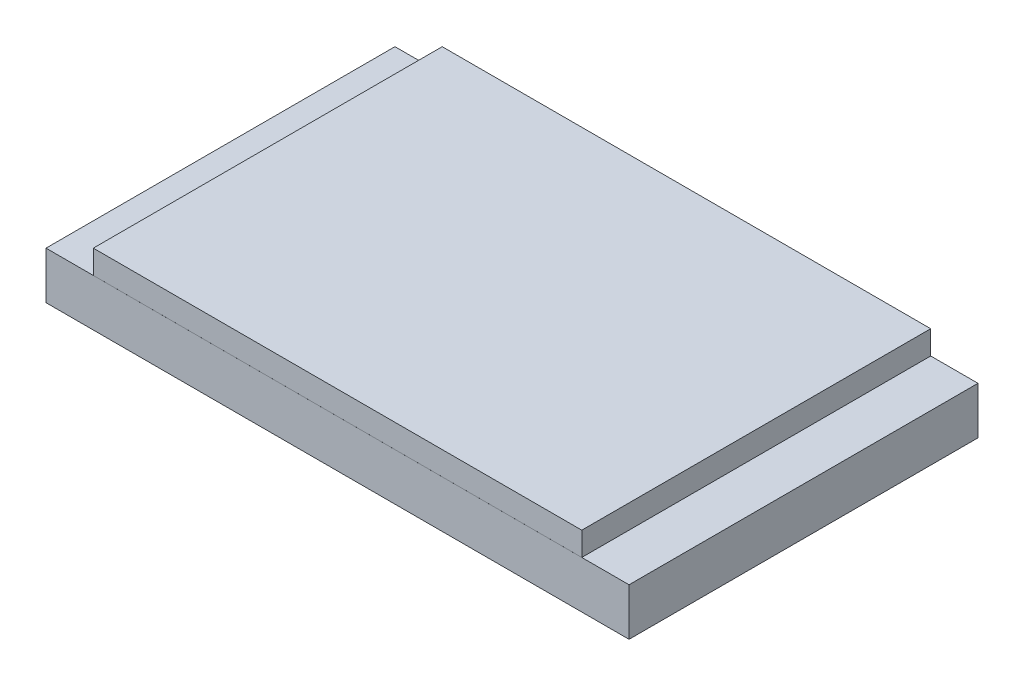
ISO-10303-21;
HEADER;
FILE_DESCRIPTION(('STEP AP214'),'2;1');
FILE_NAME('part.step','',(''),(''),'','','');
FILE_SCHEMA(('AUTOMOTIVE_DESIGN { 1 0 10303 214 1 1 1 1 }'));
ENDSEC;
DATA;
#1=APPLICATION_CONTEXT('core data for automotive mechanical design processes');
#2=APPLICATION_PROTOCOL_DEFINITION('international standard','automotive_design',2000,#1);
#3=PRODUCT_CONTEXT('',#1,'mechanical');
#4=PRODUCT('Part','Part','',(#3));
#5=PRODUCT_RELATED_PRODUCT_CATEGORY('part','',(#4));
#6=PRODUCT_DEFINITION_FORMATION('','',#4);
#7=PRODUCT_DEFINITION_CONTEXT('part definition',#1,'design');
#8=PRODUCT_DEFINITION('design','',#6,#7);
#9=PRODUCT_DEFINITION_SHAPE('','',#8);
#10=(LENGTH_UNIT() NAMED_UNIT(*) SI_UNIT(.MILLI.,.METRE.));
#11=(NAMED_UNIT(*) PLANE_ANGLE_UNIT() SI_UNIT($,.RADIAN.));
#12=(NAMED_UNIT(*) SI_UNIT($,.STERADIAN.) SOLID_ANGLE_UNIT());
#13=UNCERTAINTY_MEASURE_WITH_UNIT(LENGTH_MEASURE(1.E-05),#10,'distance_accuracy_value','');
#14=(GEOMETRIC_REPRESENTATION_CONTEXT(3) GLOBAL_UNCERTAINTY_ASSIGNED_CONTEXT((#13)) GLOBAL_UNIT_ASSIGNED_CONTEXT((#10,
#11,#12)) REPRESENTATION_CONTEXT('',''));
#15=CARTESIAN_POINT('',(0.,0.,0.));
#16=DIRECTION('',(0.,0.,1.));
#17=DIRECTION('',(1.,0.,0.));
#18=AXIS2_PLACEMENT_3D('',#15,#16,#17);
#19=CARTESIAN_POINT('',(-20.6688301686511,4.,14.7634501204651));
#20=DIRECTION('',(1.,0.,0.));
#21=DIRECTION('',(0.,0.,-1.));
#22=AXIS2_PLACEMENT_3D('',#19,#20,#21);
#23=PLANE('',#22);
#24=DIRECTION('',(0.,0.,1.));
#25=VECTOR('',#24,1.);
#26=CARTESIAN_POINT('',(-20.6688301686511,2.,14.7634501204651));
#27=LINE('',#26,#25);
#28=CARTESIAN_POINT('',(-20.6688301686511,2.,-14.763450120465));
#29=VERTEX_POINT('',#28);
#30=CARTESIAN_POINT('',(-20.6688301686511,2.,14.7634501204651));
#31=VERTEX_POINT('',#30);
#32=EDGE_CURVE('E133',#29,#31,#27,.T.);
#33=ORIENTED_EDGE('',*,*,#32,.T.);
#34=DIRECTION('',(0.,-1.,0.));
#35=VECTOR('',#34,1.);
#36=CARTESIAN_POINT('',(-20.6688301686511,4.,14.7634501204651));
#37=LINE('',#36,#35);
#38=CARTESIAN_POINT('',(-20.6688301686511,4.,14.7634501204651));
#39=VERTEX_POINT('',#38);
#40=EDGE_CURVE('E11',#39,#31,#37,.T.);
#41=ORIENTED_EDGE('',*,*,#40,.F.);
#42=DIRECTION('',(0.,0.,1.));
#43=VECTOR('',#42,1.);
#44=CARTESIAN_POINT('',(-20.6688301686511,4.,14.7634501204651));
#45=LINE('',#44,#43);
#46=CARTESIAN_POINT('',(-20.6688301686511,4.,-14.763450120465));
#47=VERTEX_POINT('',#46);
#48=EDGE_CURVE('E144',#47,#39,#45,.T.);
#49=ORIENTED_EDGE('',*,*,#48,.F.);
#50=DIRECTION('',(0.,-1.,0.));
#51=VECTOR('',#50,1.);
#52=CARTESIAN_POINT('',(-20.6688301686511,4.,-14.763450120465));
#53=LINE('',#52,#51);
#54=EDGE_CURVE('E155',#47,#29,#53,.T.);
#55=ORIENTED_EDGE('',*,*,#54,.T.);
#56=EDGE_LOOP('',(#33,#41,#49,#55));
#57=FACE_BOUND('',#56,.T.);
#58=ADVANCED_FACE('F43',(#57),#23,.F.);
#59=CARTESIAN_POINT('',(20.6688301686511,4.,14.7634501204651));
#60=DIRECTION('',(0.,0.,-1.));
#61=DIRECTION('',(-1.,0.,0.));
#62=AXIS2_PLACEMENT_3D('',#59,#60,#61);
#63=PLANE('',#62);
#64=DIRECTION('',(1.,0.,0.));
#65=VECTOR('',#64,1.);
#66=CARTESIAN_POINT('',(20.6688301686511,2.,14.7634501204651));
#67=LINE('',#66,#65);
#68=CARTESIAN_POINT('',(20.6688301686511,2.,14.7634501204651));
#69=VERTEX_POINT('',#68);
#70=EDGE_CURVE('E138',#31,#69,#67,.T.);
#71=ORIENTED_EDGE('',*,*,#70,.T.);
#72=DIRECTION('',(0.,-1.,0.));
#73=VECTOR('',#72,1.);
#74=CARTESIAN_POINT('',(20.6688301686511,4.,14.7634501204651));
#75=LINE('',#74,#73);
#76=CARTESIAN_POINT('',(20.6688301686511,4.,14.7634501204651));
#77=VERTEX_POINT('',#76);
#78=EDGE_CURVE('E52',#77,#69,#75,.T.);
#79=ORIENTED_EDGE('',*,*,#78,.F.);
#80=DIRECTION('',(1.,0.,0.));
#81=VECTOR('',#80,1.);
#82=CARTESIAN_POINT('',(20.6688301686511,4.,14.7634501204651));
#83=LINE('',#82,#81);
#84=EDGE_CURVE('E147',#39,#77,#83,.T.);
#85=ORIENTED_EDGE('',*,*,#84,.F.);
#86=ORIENTED_EDGE('',*,*,#40,.T.);
#87=EDGE_LOOP('',(#71,#79,#85,#86));
#88=FACE_BOUND('',#87,.T.);
#89=ADVANCED_FACE('F182',(#88),#63,.F.);
#90=CARTESIAN_POINT('',(20.6688301686511,4.,14.7634501204651));
#91=DIRECTION('',(-1.,0.,0.));
#92=DIRECTION('',(0.,0.,1.));
#93=AXIS2_PLACEMENT_3D('',#90,#91,#92);
#94=PLANE('',#93);
#95=DIRECTION('',(0.,0.,-1.));
#96=VECTOR('',#95,1.);
#97=CARTESIAN_POINT('',(20.6688301686511,2.,14.7634501204651));
#98=LINE('',#97,#96);
#99=CARTESIAN_POINT('',(20.6688301686511,2.,-14.763450120465));
#100=VERTEX_POINT('',#99);
#101=EDGE_CURVE('E160',#69,#100,#98,.T.);
#102=ORIENTED_EDGE('',*,*,#101,.T.);
#103=DIRECTION('',(0.,-1.,0.));
#104=VECTOR('',#103,1.);
#105=CARTESIAN_POINT('',(20.6688301686511,4.,-14.763450120465));
#106=LINE('',#105,#104);
#107=CARTESIAN_POINT('',(20.6688301686511,4.,-14.763450120465));
#108=VERTEX_POINT('',#107);
#109=EDGE_CURVE('E170',#108,#100,#106,.T.);
#110=ORIENTED_EDGE('',*,*,#109,.F.);
#111=DIRECTION('',(0.,0.,-1.));
#112=VECTOR('',#111,1.);
#113=CARTESIAN_POINT('',(20.6688301686511,4.,14.7634501204651));
#114=LINE('',#113,#112);
#115=EDGE_CURVE('E151',#77,#108,#114,.T.);
#116=ORIENTED_EDGE('',*,*,#115,.F.);
#117=ORIENTED_EDGE('',*,*,#78,.T.);
#118=EDGE_LOOP('',(#102,#110,#116,#117));
#119=FACE_BOUND('',#118,.T.);
#120=ADVANCED_FACE('F178',(#119),#94,.F.);
#121=CARTESIAN_POINT('',(20.6688301686511,4.,-14.763450120465));
#122=DIRECTION('',(0.,0.,1.));
#123=DIRECTION('',(1.,0.,0.));
#124=AXIS2_PLACEMENT_3D('',#121,#122,#123);
#125=PLANE('',#124);
#126=DIRECTION('',(-1.,0.,0.));
#127=VECTOR('',#126,1.);
#128=CARTESIAN_POINT('',(20.6688301686511,2.,-14.763450120465));
#129=LINE('',#128,#127);
#130=EDGE_CURVE('E148',#100,#29,#129,.T.);
#131=ORIENTED_EDGE('',*,*,#130,.T.);
#132=ORIENTED_EDGE('',*,*,#54,.F.);
#133=DIRECTION('',(-1.,0.,0.));
#134=VECTOR('',#133,1.);
#135=CARTESIAN_POINT('',(20.6688301686511,4.,-14.763450120465));
#136=LINE('',#135,#134);
#137=EDGE_CURVE('E59',#108,#47,#136,.T.);
#138=ORIENTED_EDGE('',*,*,#137,.F.);
#139=ORIENTED_EDGE('',*,*,#109,.T.);
#140=EDGE_LOOP('',(#131,#132,#138,#139));
#141=FACE_BOUND('',#140,.T.);
#142=ADVANCED_FACE('F185',(#141),#125,.F.);
#143=CARTESIAN_POINT('',(0.,4.,0.));
#144=DIRECTION('',(0.,1.,0.));
#145=DIRECTION('',(0.,0.,1.));
#146=AXIS2_PLACEMENT_3D('',#143,#144,#145);
#147=PLANE('',#146);
#148=ORIENTED_EDGE('',*,*,#48,.T.);
#149=ORIENTED_EDGE('',*,*,#84,.T.);
#150=ORIENTED_EDGE('',*,*,#115,.T.);
#151=ORIENTED_EDGE('',*,*,#137,.T.);
#152=EDGE_LOOP('',(#148,#149,#150,#151));
#153=FACE_BOUND('',#152,.T.);
#154=ADVANCED_FACE('F188',(#153),#147,.T.);
#155=CARTESIAN_POINT('',(0.,2.,0.));
#156=DIRECTION('',(0.,1.,0.));
#157=DIRECTION('',(0.,0.,1.));
#158=AXIS2_PLACEMENT_3D('',#155,#156,#157);
#159=PLANE('',#158);
#160=DIRECTION('',(0.,0.,1.));
#161=VECTOR('',#160,1.);
#162=CARTESIAN_POINT('',(-24.67,2.,14.765));
#163=LINE('',#162,#161);
#164=CARTESIAN_POINT('',(-24.67,2.,-14.765));
#165=VERTEX_POINT('',#164);
#166=CARTESIAN_POINT('',(-24.67,2.,14.765));
#167=VERTEX_POINT('',#166);
#168=EDGE_CURVE('E116',#165,#167,#163,.T.);
#169=ORIENTED_EDGE('',*,*,#168,.T.);
#170=DIRECTION('',(1.,0.,0.));
#171=VECTOR('',#170,1.);
#172=CARTESIAN_POINT('',(24.67,2.,14.765));
#173=LINE('',#172,#171);
#174=CARTESIAN_POINT('',(24.67,2.,14.765));
#175=VERTEX_POINT('',#174);
#176=EDGE_CURVE('E104',#167,#175,#173,.T.);
#177=ORIENTED_EDGE('',*,*,#176,.T.);
#178=DIRECTION('',(0.,0.,-1.));
#179=VECTOR('',#178,1.);
#180=CARTESIAN_POINT('',(24.67,2.,14.765));
#181=LINE('',#180,#179);
#182=CARTESIAN_POINT('',(24.67,2.,-14.765));
#183=VERTEX_POINT('',#182);
#184=EDGE_CURVE('E115',#175,#183,#181,.T.);
#185=ORIENTED_EDGE('',*,*,#184,.T.);
#186=DIRECTION('',(-1.,0.,0.));
#187=VECTOR('',#186,1.);
#188=CARTESIAN_POINT('',(24.67,2.,-14.765));
#189=LINE('',#188,#187);
#190=EDGE_CURVE('E122',#183,#165,#189,.T.);
#191=ORIENTED_EDGE('',*,*,#190,.T.);
#192=EDGE_LOOP('',(#169,#177,#185,#191));
#193=FACE_BOUND('',#192,.T.);
#194=ORIENTED_EDGE('',*,*,#32,.F.);
#195=ORIENTED_EDGE('',*,*,#130,.F.);
#196=ORIENTED_EDGE('',*,*,#101,.F.);
#197=ORIENTED_EDGE('',*,*,#70,.F.);
#198=EDGE_LOOP('',(#194,#195,#196,#197));
#199=FACE_BOUND('',#198,.T.);
#200=ADVANCED_FACE('F119',(#193,#199),#159,.T.);
#201=CARTESIAN_POINT('',(-24.67,2.,14.765));
#202=DIRECTION('',(1.,0.,0.));
#203=DIRECTION('',(0.,0.,-1.));
#204=AXIS2_PLACEMENT_3D('',#201,#202,#203);
#205=PLANE('',#204);
#206=DIRECTION('',(0.,0.,1.));
#207=VECTOR('',#206,1.);
#208=CARTESIAN_POINT('',(-24.67,-2.,14.765));
#209=LINE('',#208,#207);
#210=CARTESIAN_POINT('',(-24.67,-2.,-14.765));
#211=VERTEX_POINT('',#210);
#212=CARTESIAN_POINT('',(-24.67,-2.,14.765));
#213=VERTEX_POINT('',#212);
#214=EDGE_CURVE('E131',#211,#213,#209,.T.);
#215=ORIENTED_EDGE('',*,*,#214,.T.);
#216=DIRECTION('',(0.,-1.,0.));
#217=VECTOR('',#216,1.);
#218=CARTESIAN_POINT('',(-24.67,2.,14.765));
#219=LINE('',#218,#217);
#220=EDGE_CURVE('E108',#167,#213,#219,.T.);
#221=ORIENTED_EDGE('',*,*,#220,.F.);
#222=ORIENTED_EDGE('',*,*,#168,.F.);
#223=DIRECTION('',(0.,-1.,0.));
#224=VECTOR('',#223,1.);
#225=CARTESIAN_POINT('',(-24.67,2.,-14.765));
#226=LINE('',#225,#224);
#227=EDGE_CURVE('E318',#165,#211,#226,.T.);
#228=ORIENTED_EDGE('',*,*,#227,.T.);
#229=EDGE_LOOP('',(#215,#221,#222,#228));
#230=FACE_BOUND('',#229,.T.);
#231=ADVANCED_FACE('F129',(#230),#205,.F.);
#232=CARTESIAN_POINT('',(24.67,2.,14.765));
#233=DIRECTION('',(0.,0.,-1.));
#234=DIRECTION('',(-1.,0.,0.));
#235=AXIS2_PLACEMENT_3D('',#232,#233,#234);
#236=PLANE('',#235);
#237=DIRECTION('',(1.,0.,0.));
#238=VECTOR('',#237,1.);
#239=CARTESIAN_POINT('',(24.67,-2.,14.765));
#240=LINE('',#239,#238);
#241=CARTESIAN_POINT('',(24.67,-2.,14.765));
#242=VERTEX_POINT('',#241);
#243=EDGE_CURVE('E305',#213,#242,#240,.T.);
#244=ORIENTED_EDGE('',*,*,#243,.T.);
#245=DIRECTION('',(0.,-1.,0.));
#246=VECTOR('',#245,1.);
#247=CARTESIAN_POINT('',(24.67,2.,14.765));
#248=LINE('',#247,#246);
#249=EDGE_CURVE('E111',#175,#242,#248,.T.);
#250=ORIENTED_EDGE('',*,*,#249,.F.);
#251=ORIENTED_EDGE('',*,*,#176,.F.);
#252=ORIENTED_EDGE('',*,*,#220,.T.);
#253=EDGE_LOOP('',(#244,#250,#251,#252));
#254=FACE_BOUND('',#253,.T.);
#255=ADVANCED_FACE('F106',(#254),#236,.F.);
#256=CARTESIAN_POINT('',(24.67,2.,14.765));
#257=DIRECTION('',(-1.,0.,0.));
#258=DIRECTION('',(0.,0.,1.));
#259=AXIS2_PLACEMENT_3D('',#256,#257,#258);
#260=PLANE('',#259);
#261=DIRECTION('',(0.,0.,-1.));
#262=VECTOR('',#261,1.);
#263=CARTESIAN_POINT('',(24.67,-2.,14.765));
#264=LINE('',#263,#262);
#265=CARTESIAN_POINT('',(24.67,-2.,-14.765));
#266=VERTEX_POINT('',#265);
#267=EDGE_CURVE('E309',#242,#266,#264,.T.);
#268=ORIENTED_EDGE('',*,*,#267,.T.);
#269=DIRECTION('',(0.,-1.,0.));
#270=VECTOR('',#269,1.);
#271=CARTESIAN_POINT('',(24.67,2.,-14.765));
#272=LINE('',#271,#270);
#273=EDGE_CURVE('E140',#183,#266,#272,.T.);
#274=ORIENTED_EDGE('',*,*,#273,.F.);
#275=ORIENTED_EDGE('',*,*,#184,.F.);
#276=ORIENTED_EDGE('',*,*,#249,.T.);
#277=EDGE_LOOP('',(#268,#274,#275,#276));
#278=FACE_BOUND('',#277,.T.);
#279=ADVANCED_FACE('F238',(#278),#260,.F.);
#280=CARTESIAN_POINT('',(24.67,2.,-14.765));
#281=DIRECTION('',(0.,0.,1.));
#282=DIRECTION('',(1.,0.,0.));
#283=AXIS2_PLACEMENT_3D('',#280,#281,#282);
#284=PLANE('',#283);
#285=DIRECTION('',(-1.,0.,0.));
#286=VECTOR('',#285,1.);
#287=CARTESIAN_POINT('',(24.67,-2.,-14.765));
#288=LINE('',#287,#286);
#289=EDGE_CURVE('E127',#266,#211,#288,.T.);
#290=ORIENTED_EDGE('',*,*,#289,.T.);
#291=ORIENTED_EDGE('',*,*,#227,.F.);
#292=ORIENTED_EDGE('',*,*,#190,.F.);
#293=ORIENTED_EDGE('',*,*,#273,.T.);
#294=EDGE_LOOP('',(#290,#291,#292,#293));
#295=FACE_BOUND('',#294,.T.);
#296=ADVANCED_FACE('F248',(#295),#284,.F.);
#297=CARTESIAN_POINT('',(0.,-2.,0.));
#298=DIRECTION('',(0.,1.,0.));
#299=DIRECTION('',(0.,0.,1.));
#300=AXIS2_PLACEMENT_3D('',#297,#298,#299);
#301=PLANE('',#300);
#302=ORIENTED_EDGE('',*,*,#214,.F.);
#303=ORIENTED_EDGE('',*,*,#289,.F.);
#304=ORIENTED_EDGE('',*,*,#267,.F.);
#305=ORIENTED_EDGE('',*,*,#243,.F.);
#306=EDGE_LOOP('',(#302,#303,#304,#305));
#307=FACE_BOUND('',#306,.T.);
#308=ADVANCED_FACE('F259',(#307),#301,.F.);
#309=CLOSED_SHELL('',(#58,#89,#120,#142,#154,#200,#231,#255,#279,#296,#308));
#310=MANIFOLD_SOLID_BREP('B2',#309);
#311=ADVANCED_BREP_SHAPE_REPRESENTATION('',(#18,#310),#14);
#312=SHAPE_DEFINITION_REPRESENTATION(#9,#311);
ENDSEC;
END-ISO-10303-21;
